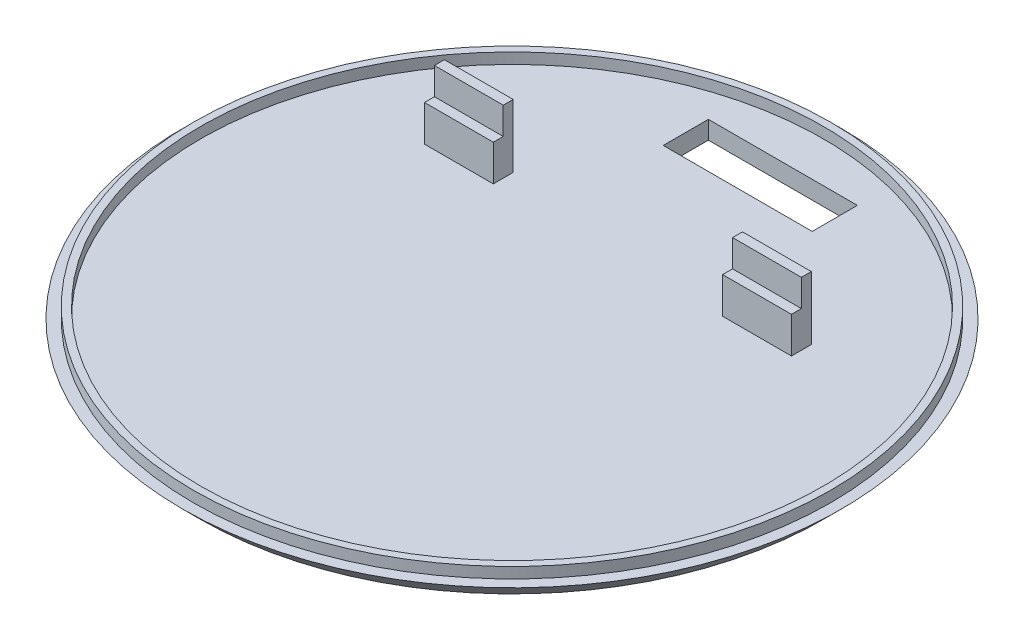
ISO-10303-21;
HEADER;
FILE_DESCRIPTION(('STEP AP214'),'2;1');
FILE_NAME('part.step','',(''),(''),'','','');
FILE_SCHEMA(('AUTOMOTIVE_DESIGN { 1 0 10303 214 1 1 1 1 }'));
ENDSEC;
DATA;
#1=APPLICATION_CONTEXT('core data for automotive mechanical design processes');
#2=APPLICATION_PROTOCOL_DEFINITION('international standard','automotive_design',2000,#1);
#3=PRODUCT_CONTEXT('',#1,'mechanical');
#4=PRODUCT('Part','Part','',(#3));
#5=PRODUCT_RELATED_PRODUCT_CATEGORY('part','',(#4));
#6=PRODUCT_DEFINITION_FORMATION('','',#4);
#7=PRODUCT_DEFINITION_CONTEXT('part definition',#1,'design');
#8=PRODUCT_DEFINITION('design','',#6,#7);
#9=PRODUCT_DEFINITION_SHAPE('','',#8);
#10=(LENGTH_UNIT() NAMED_UNIT(*) SI_UNIT(.MILLI.,.METRE.));
#11=(NAMED_UNIT(*) PLANE_ANGLE_UNIT() SI_UNIT($,.RADIAN.));
#12=(NAMED_UNIT(*) SI_UNIT($,.STERADIAN.) SOLID_ANGLE_UNIT());
#13=UNCERTAINTY_MEASURE_WITH_UNIT(LENGTH_MEASURE(1.E-05),#10,'distance_accuracy_value','');
#14=(GEOMETRIC_REPRESENTATION_CONTEXT(3) GLOBAL_UNCERTAINTY_ASSIGNED_CONTEXT((#13)) GLOBAL_UNIT_ASSIGNED_CONTEXT((#10,
#11,#12)) REPRESENTATION_CONTEXT('',''));
#15=CARTESIAN_POINT('',(0.,0.,0.));
#16=DIRECTION('',(0.,0.,1.));
#17=DIRECTION('',(1.,0.,0.));
#18=AXIS2_PLACEMENT_3D('',#15,#16,#17);
#19=CARTESIAN_POINT('',(0.,0.,0.));
#20=DIRECTION('',(0.,1.,0.));
#21=DIRECTION('',(0.,0.,1.));
#22=AXIS2_PLACEMENT_3D('',#19,#20,#21);
#23=PLANE('',#22);
#24=DIRECTION('',(0.,0.,1.));
#25=VECTOR('',#24,1.);
#26=CARTESIAN_POINT('',(-8.25,0.,-25.));
#27=LINE('',#26,#25);
#28=CARTESIAN_POINT('',(-8.25,0.,-30.));
#29=VERTEX_POINT('',#28);
#30=CARTESIAN_POINT('',(-8.25,0.,-25.));
#31=VERTEX_POINT('',#30);
#32=EDGE_CURVE('E300',#29,#31,#27,.T.);
#33=ORIENTED_EDGE('',*,*,#32,.F.);
#34=DIRECTION('',(-1.,0.,0.));
#35=VECTOR('',#34,1.);
#36=CARTESIAN_POINT('',(-8.25,0.,-30.));
#37=LINE('',#36,#35);
#38=CARTESIAN_POINT('',(8.25,0.,-30.));
#39=VERTEX_POINT('',#38);
#40=EDGE_CURVE('E311',#39,#29,#37,.T.);
#41=ORIENTED_EDGE('',*,*,#40,.F.);
#42=DIRECTION('',(0.,0.,-1.));
#43=VECTOR('',#42,1.);
#44=CARTESIAN_POINT('',(8.25,0.,-25.));
#45=LINE('',#44,#43);
#46=CARTESIAN_POINT('',(8.25,0.,-25.));
#47=VERTEX_POINT('',#46);
#48=EDGE_CURVE('E307',#47,#39,#45,.T.);
#49=ORIENTED_EDGE('',*,*,#48,.F.);
#50=DIRECTION('',(1.,0.,0.));
#51=VECTOR('',#50,1.);
#52=CARTESIAN_POINT('',(-8.25,0.,-25.));
#53=LINE('',#52,#51);
#54=EDGE_CURVE('E303',#31,#47,#53,.T.);
#55=ORIENTED_EDGE('',*,*,#54,.F.);
#56=EDGE_LOOP('',(#33,#41,#49,#55));
#57=FACE_BOUND('',#56,.T.);
#58=CARTESIAN_POINT('',(0.,0.,0.));
#59=DIRECTION('',(0.,1.,0.));
#60=DIRECTION('',(0.,0.,1.));
#61=AXIS2_PLACEMENT_3D('',#58,#59,#60);
#62=CIRCLE('',#61,34.5);
#63=CARTESIAN_POINT('',(0.,0.,34.5));
#64=VERTEX_POINT('',#63);
#65=EDGE_CURVE('E11',#64,#64,#62,.F.);
#66=ORIENTED_EDGE('',*,*,#65,.F.);
#67=EDGE_LOOP('',(#66));
#68=FACE_BOUND('',#67,.T.);
#69=DIRECTION('',(1.,0.,0.));
#70=VECTOR('',#69,1.);
#71=CARTESIAN_POINT('',(-21.59,0.,-11.9));
#72=LINE('',#71,#70);
#73=CARTESIAN_POINT('',(-21.59,0.,-11.9));
#74=VERTEX_POINT('',#73);
#75=CARTESIAN_POINT('',(-13.97,0.,-11.9));
#76=VERTEX_POINT('',#75);
#77=EDGE_CURVE('E266',#74,#76,#72,.T.);
#78=ORIENTED_EDGE('',*,*,#77,.F.);
#79=DIRECTION('',(0.,0.,1.));
#80=VECTOR('',#79,1.);
#81=CARTESIAN_POINT('',(-21.59,0.,-14.1));
#82=LINE('',#81,#80);
#83=CARTESIAN_POINT('',(-21.59,0.,-14.1));
#84=VERTEX_POINT('',#83);
#85=EDGE_CURVE('E251',#84,#74,#82,.T.);
#86=ORIENTED_EDGE('',*,*,#85,.F.);
#87=DIRECTION('',(-1.,0.,0.));
#88=VECTOR('',#87,1.);
#89=CARTESIAN_POINT('',(-21.59,0.,-14.1));
#90=LINE('',#89,#88);
#91=CARTESIAN_POINT('',(-13.97,0.,-14.1));
#92=VERTEX_POINT('',#91);
#93=EDGE_CURVE('E256',#92,#84,#90,.T.);
#94=ORIENTED_EDGE('',*,*,#93,.F.);
#95=DIRECTION('',(0.,0.,-1.));
#96=VECTOR('',#95,1.);
#97=CARTESIAN_POINT('',(-13.97,0.,-14.1));
#98=LINE('',#97,#96);
#99=EDGE_CURVE('E269',#76,#92,#98,.T.);
#100=ORIENTED_EDGE('',*,*,#99,.F.);
#101=EDGE_LOOP('',(#78,#86,#94,#100));
#102=FACE_BOUND('',#101,.T.);
#103=DIRECTION('',(1.,0.,0.));
#104=VECTOR('',#103,1.);
#105=CARTESIAN_POINT('',(11.43,0.,-11.9));
#106=LINE('',#105,#104);
#107=CARTESIAN_POINT('',(11.43,0.,-11.9));
#108=VERTEX_POINT('',#107);
#109=CARTESIAN_POINT('',(19.05,0.,-11.9));
#110=VERTEX_POINT('',#109);
#111=EDGE_CURVE('E230',#108,#110,#106,.T.);
#112=ORIENTED_EDGE('',*,*,#111,.F.);
#113=DIRECTION('',(0.,0.,1.));
#114=VECTOR('',#113,1.);
#115=CARTESIAN_POINT('',(11.43,0.,-14.1));
#116=LINE('',#115,#114);
#117=CARTESIAN_POINT('',(11.43,0.,-14.1));
#118=VERTEX_POINT('',#117);
#119=EDGE_CURVE('E217',#118,#108,#116,.T.);
#120=ORIENTED_EDGE('',*,*,#119,.F.);
#121=DIRECTION('',(-1.,0.,0.));
#122=VECTOR('',#121,1.);
#123=CARTESIAN_POINT('',(11.43,0.,-14.1));
#124=LINE('',#123,#122);
#125=CARTESIAN_POINT('',(19.05,0.,-14.1));
#126=VERTEX_POINT('',#125);
#127=EDGE_CURVE('E221',#126,#118,#124,.T.);
#128=ORIENTED_EDGE('',*,*,#127,.F.);
#129=DIRECTION('',(0.,0.,-1.));
#130=VECTOR('',#129,1.);
#131=CARTESIAN_POINT('',(19.05,0.,-14.1));
#132=LINE('',#131,#130);
#133=EDGE_CURVE('E233',#110,#126,#132,.T.);
#134=ORIENTED_EDGE('',*,*,#133,.F.);
#135=EDGE_LOOP('',(#112,#120,#128,#134));
#136=FACE_BOUND('',#135,.T.);
#137=ADVANCED_FACE('F43',(#57,#68,#102,#136),#23,.T.);
#138=CARTESIAN_POINT('',(0.,-2.,0.));
#139=DIRECTION('',(0.,-1.,0.));
#140=DIRECTION('',(0.,0.,-1.));
#141=AXIS2_PLACEMENT_3D('',#138,#139,#140);
#142=PLANE('',#141);
#143=DIRECTION('',(0.,0.,1.));
#144=VECTOR('',#143,1.);
#145=CARTESIAN_POINT('',(-8.25,-2.,-25.));
#146=LINE('',#145,#144);
#147=CARTESIAN_POINT('',(-8.25,-2.,-30.));
#148=VERTEX_POINT('',#147);
#149=CARTESIAN_POINT('',(-8.25,-2.,-25.));
#150=VERTEX_POINT('',#149);
#151=EDGE_CURVE('E296',#148,#150,#146,.T.);
#152=ORIENTED_EDGE('',*,*,#151,.T.);
#153=DIRECTION('',(1.,0.,0.));
#154=VECTOR('',#153,1.);
#155=CARTESIAN_POINT('',(-8.25,-2.,-25.));
#156=LINE('',#155,#154);
#157=CARTESIAN_POINT('',(8.25,-2.,-25.));
#158=VERTEX_POINT('',#157);
#159=EDGE_CURVE('E319',#150,#158,#156,.T.);
#160=ORIENTED_EDGE('',*,*,#159,.T.);
#161=DIRECTION('',(0.,0.,-1.));
#162=VECTOR('',#161,1.);
#163=CARTESIAN_POINT('',(8.25,-2.,-25.));
#164=LINE('',#163,#162);
#165=CARTESIAN_POINT('',(8.25,-2.,-30.));
#166=VERTEX_POINT('',#165);
#167=EDGE_CURVE('E288',#158,#166,#164,.T.);
#168=ORIENTED_EDGE('',*,*,#167,.T.);
#169=DIRECTION('',(-1.,0.,0.));
#170=VECTOR('',#169,1.);
#171=CARTESIAN_POINT('',(-8.25,-2.,-30.));
#172=LINE('',#171,#170);
#173=EDGE_CURVE('E292',#166,#148,#172,.T.);
#174=ORIENTED_EDGE('',*,*,#173,.T.);
#175=EDGE_LOOP('',(#152,#160,#168,#174));
#176=FACE_BOUND('',#175,.T.);
#177=CARTESIAN_POINT('',(0.,-1.99999999999999,0.));
#178=DIRECTION('',(0.,1.,0.));
#179=DIRECTION('',(0.,0.,1.));
#180=AXIS2_PLACEMENT_3D('',#177,#178,#179);
#181=CIRCLE('',#180,34.5);
#182=CARTESIAN_POINT('',(0.,-1.99999999999999,34.5));
#183=VERTEX_POINT('',#182);
#184=EDGE_CURVE('E337',#183,#183,#181,.T.);
#185=ORIENTED_EDGE('',*,*,#184,.F.);
#186=EDGE_LOOP('',(#185));
#187=FACE_BOUND('',#186,.T.);
#188=ADVANCED_FACE('F369',(#176,#187),#142,.T.);
#189=CARTESIAN_POINT('',(0.,0.,0.));
#190=DIRECTION('',(0.,1.,0.));
#191=DIRECTION('',(0.,0.,1.));
#192=AXIS2_PLACEMENT_3D('',#189,#190,#191);
#193=CONICAL_SURFACE('',#192,36.5,0.78539816339744);
#194=ORIENTED_EDGE('',*,*,#184,.T.);
#195=EDGE_LOOP('',(#194));
#196=FACE_BOUND('',#195,.T.);
#197=CARTESIAN_POINT('',(0.,0.,0.));
#198=DIRECTION('',(0.,1.,0.));
#199=DIRECTION('',(0.,0.,1.));
#200=AXIS2_PLACEMENT_3D('',#197,#198,#199);
#201=CIRCLE('',#200,36.5);
#202=CARTESIAN_POINT('',(0.,0.,36.5));
#203=VERTEX_POINT('',#202);
#204=EDGE_CURVE('E333',#203,#203,#201,.T.);
#205=ORIENTED_EDGE('',*,*,#204,.F.);
#206=EDGE_LOOP('',(#205));
#207=FACE_BOUND('',#206,.T.);
#208=ADVANCED_FACE('F364',(#196,#207),#193,.T.);
#209=CARTESIAN_POINT('',(0.,0.,0.));
#210=DIRECTION('',(0.,1.,0.));
#211=DIRECTION('',(0.,0.,1.));
#212=AXIS2_PLACEMENT_3D('',#209,#210,#211);
#213=CIRCLE('',#212,35.3);
#214=CARTESIAN_POINT('',(0.,0.,35.3));
#215=VERTEX_POINT('',#214);
#216=EDGE_CURVE('E53',#215,#215,#213,.F.);
#217=ORIENTED_EDGE('',*,*,#216,.T.);
#218=EDGE_LOOP('',(#217));
#219=FACE_BOUND('',#218,.T.);
#220=ORIENTED_EDGE('',*,*,#204,.T.);
#221=EDGE_LOOP('',(#220));
#222=FACE_BOUND('',#221,.T.);
#223=ADVANCED_FACE('F356',(#219,#222),#23,.T.);
#224=CARTESIAN_POINT('',(35.3,1.2,0.));
#225=DIRECTION('',(0.,-1.,0.));
#226=DIRECTION('',(0.,0.,-1.));
#227=AXIS2_PLACEMENT_3D('',#224,#225,#226);
#228=PLANE('',#227);
#229=CARTESIAN_POINT('',(0.,1.2,0.));
#230=DIRECTION('',(0.,1.,0.));
#231=DIRECTION('',(0.,0.,1.));
#232=AXIS2_PLACEMENT_3D('',#229,#230,#231);
#233=CIRCLE('',#232,34.5);
#234=CARTESIAN_POINT('',(0.,1.2,34.5));
#235=VERTEX_POINT('',#234);
#236=EDGE_CURVE('E47',#235,#235,#233,.T.);
#237=ORIENTED_EDGE('',*,*,#236,.F.);
#238=EDGE_LOOP('',(#237));
#239=FACE_BOUND('',#238,.T.);
#240=CARTESIAN_POINT('',(0.,1.2,0.));
#241=DIRECTION('',(0.,1.,0.));
#242=DIRECTION('',(0.,0.,1.));
#243=AXIS2_PLACEMENT_3D('',#240,#241,#242);
#244=CIRCLE('',#243,35.3);
#245=CARTESIAN_POINT('',(0.,1.2,35.3));
#246=VERTEX_POINT('',#245);
#247=EDGE_CURVE('E332',#246,#246,#244,.T.);
#248=ORIENTED_EDGE('',*,*,#247,.T.);
#249=EDGE_LOOP('',(#248));
#250=FACE_BOUND('',#249,.T.);
#251=ADVANCED_FACE('F353',(#239,#250),#228,.F.);
#252=CARTESIAN_POINT('',(0.,31.706596316955,0.));
#253=DIRECTION('',(0.,1.,0.));
#254=DIRECTION('',(0.,0.,1.));
#255=AXIS2_PLACEMENT_3D('',#252,#253,#254);
#256=CYLINDRICAL_SURFACE('',#255,35.3);
#257=ORIENTED_EDGE('',*,*,#247,.F.);
#258=EDGE_LOOP('',(#257));
#259=FACE_BOUND('',#258,.T.);
#260=ORIENTED_EDGE('',*,*,#216,.F.);
#261=EDGE_LOOP('',(#260));
#262=FACE_BOUND('',#261,.T.);
#263=ADVANCED_FACE('F355',(#259,#262),#256,.T.);
#264=CARTESIAN_POINT('',(0.,31.706596316955,0.));
#265=DIRECTION('',(0.,1.,0.));
#266=DIRECTION('',(0.,0.,1.));
#267=AXIS2_PLACEMENT_3D('',#264,#265,#266);
#268=CYLINDRICAL_SURFACE('',#267,34.5);
#269=ORIENTED_EDGE('',*,*,#236,.T.);
#270=EDGE_LOOP('',(#269));
#271=FACE_BOUND('',#270,.T.);
#272=ORIENTED_EDGE('',*,*,#65,.T.);
#273=EDGE_LOOP('',(#272));
#274=FACE_BOUND('',#273,.T.);
#275=ADVANCED_FACE('F45',(#271,#274),#268,.F.);
#276=CARTESIAN_POINT('',(-8.25,-2.001,-25.));
#277=DIRECTION('',(-1.,0.,0.));
#278=DIRECTION('',(0.,0.,1.));
#279=AXIS2_PLACEMENT_3D('',#276,#277,#278);
#280=PLANE('',#279);
#281=DIRECTION('',(0.,1.,0.));
#282=VECTOR('',#281,1.);
#283=CARTESIAN_POINT('',(-8.25,-2.001,-30.));
#284=LINE('',#283,#282);
#285=EDGE_CURVE('E316',#148,#29,#284,.T.);
#286=ORIENTED_EDGE('',*,*,#285,.T.);
#287=ORIENTED_EDGE('',*,*,#32,.T.);
#288=DIRECTION('',(0.,1.,0.));
#289=VECTOR('',#288,1.);
#290=CARTESIAN_POINT('',(-8.25,-2.001,-25.));
#291=LINE('',#290,#289);
#292=EDGE_CURVE('E315',#150,#31,#291,.T.);
#293=ORIENTED_EDGE('',*,*,#292,.F.);
#294=ORIENTED_EDGE('',*,*,#151,.F.);
#295=EDGE_LOOP('',(#286,#287,#293,#294));
#296=FACE_BOUND('',#295,.T.);
#297=ADVANCED_FACE('F363',(#296),#280,.F.);
#298=CARTESIAN_POINT('',(-8.25,-2.001,-30.));
#299=DIRECTION('',(0.,0.,-1.));
#300=DIRECTION('',(-1.,0.,0.));
#301=AXIS2_PLACEMENT_3D('',#298,#299,#300);
#302=PLANE('',#301);
#303=DIRECTION('',(0.,1.,0.));
#304=VECTOR('',#303,1.);
#305=CARTESIAN_POINT('',(8.25,-2.001,-30.));
#306=LINE('',#305,#304);
#307=EDGE_CURVE('E320',#166,#39,#306,.T.);
#308=ORIENTED_EDGE('',*,*,#307,.T.);
#309=ORIENTED_EDGE('',*,*,#40,.T.);
#310=ORIENTED_EDGE('',*,*,#285,.F.);
#311=ORIENTED_EDGE('',*,*,#173,.F.);
#312=EDGE_LOOP('',(#308,#309,#310,#311));
#313=FACE_BOUND('',#312,.T.);
#314=ADVANCED_FACE('F426',(#313),#302,.F.);
#315=CARTESIAN_POINT('',(8.25,-2.001,-25.));
#316=DIRECTION('',(1.,0.,0.));
#317=DIRECTION('',(0.,0.,-1.));
#318=AXIS2_PLACEMENT_3D('',#315,#316,#317);
#319=PLANE('',#318);
#320=DIRECTION('',(0.,1.,0.));
#321=VECTOR('',#320,1.);
#322=CARTESIAN_POINT('',(8.25,-2.001,-25.));
#323=LINE('',#322,#321);
#324=EDGE_CURVE('E323',#158,#47,#323,.T.);
#325=ORIENTED_EDGE('',*,*,#324,.T.);
#326=ORIENTED_EDGE('',*,*,#48,.T.);
#327=ORIENTED_EDGE('',*,*,#307,.F.);
#328=ORIENTED_EDGE('',*,*,#167,.F.);
#329=EDGE_LOOP('',(#325,#326,#327,#328));
#330=FACE_BOUND('',#329,.T.);
#331=ADVANCED_FACE('F435',(#330),#319,.F.);
#332=CARTESIAN_POINT('',(-8.25,-2.001,-25.));
#333=DIRECTION('',(0.,0.,1.));
#334=DIRECTION('',(1.,0.,0.));
#335=AXIS2_PLACEMENT_3D('',#332,#333,#334);
#336=PLANE('',#335);
#337=ORIENTED_EDGE('',*,*,#292,.T.);
#338=ORIENTED_EDGE('',*,*,#54,.T.);
#339=ORIENTED_EDGE('',*,*,#324,.F.);
#340=ORIENTED_EDGE('',*,*,#159,.F.);
#341=EDGE_LOOP('',(#337,#338,#339,#340));
#342=FACE_BOUND('',#341,.T.);
#343=ADVANCED_FACE('F445',(#342),#336,.F.);
#344=CARTESIAN_POINT('',(-21.59,4.,-14.1));
#345=DIRECTION('',(1.,0.,0.));
#346=DIRECTION('',(0.,0.,-1.));
#347=AXIS2_PLACEMENT_3D('',#344,#345,#346);
#348=PLANE('',#347);
#349=ORIENTED_EDGE('',*,*,#85,.T.);
#350=DIRECTION('',(0.,-1.,0.));
#351=VECTOR('',#350,1.);
#352=CARTESIAN_POINT('',(-21.59,4.,-11.9));
#353=LINE('',#352,#351);
#354=CARTESIAN_POINT('',(-21.59,4.,-11.9));
#355=VERTEX_POINT('',#354);
#356=EDGE_CURVE('E285',#355,#74,#353,.T.);
#357=ORIENTED_EDGE('',*,*,#356,.F.);
#358=DIRECTION('',(0.,0.,1.));
#359=VECTOR('',#358,1.);
#360=CARTESIAN_POINT('',(-21.59,4.,-14.1));
#361=LINE('',#360,#359);
#362=CARTESIAN_POINT('',(-21.59,4.,-13.));
#363=VERTEX_POINT('',#362);
#364=EDGE_CURVE('E252',#363,#355,#361,.T.);
#365=ORIENTED_EDGE('',*,*,#364,.F.);
#366=DIRECTION('',(0.,-1.,0.));
#367=VECTOR('',#366,1.);
#368=CARTESIAN_POINT('',(-21.59,7.,-13.));
#369=LINE('',#368,#367);
#370=CARTESIAN_POINT('',(-21.59,7.,-13.));
#371=VERTEX_POINT('',#370);
#372=EDGE_CURVE('E213',#371,#363,#369,.T.);
#373=ORIENTED_EDGE('',*,*,#372,.F.);
#374=DIRECTION('',(0.,0.,1.));
#375=VECTOR('',#374,1.);
#376=CARTESIAN_POINT('',(-21.59,7.,-14.1));
#377=LINE('',#376,#375);
#378=CARTESIAN_POINT('',(-21.59,7.,-14.1));
#379=VERTEX_POINT('',#378);
#380=EDGE_CURVE('E190',#379,#371,#377,.T.);
#381=ORIENTED_EDGE('',*,*,#380,.F.);
#382=DIRECTION('',(0.,-1.,0.));
#383=VECTOR('',#382,1.);
#384=CARTESIAN_POINT('',(-21.59,4.,-14.1));
#385=LINE('',#384,#383);
#386=EDGE_CURVE('E262',#379,#84,#385,.T.);
#387=ORIENTED_EDGE('',*,*,#386,.T.);
#388=EDGE_LOOP('',(#349,#357,#365,#373,#381,#387));
#389=FACE_BOUND('',#388,.T.);
#390=ADVANCED_FACE('F454',(#389),#348,.F.);
#391=CARTESIAN_POINT('',(-21.59,4.,-11.9));
#392=DIRECTION('',(0.,0.,-1.));
#393=DIRECTION('',(-1.,0.,0.));
#394=AXIS2_PLACEMENT_3D('',#391,#392,#393);
#395=PLANE('',#394);
#396=ORIENTED_EDGE('',*,*,#77,.T.);
#397=DIRECTION('',(0.,-1.,0.));
#398=VECTOR('',#397,1.);
#399=CARTESIAN_POINT('',(-13.97,4.,-11.9));
#400=LINE('',#399,#398);
#401=CARTESIAN_POINT('',(-13.97,4.,-11.9));
#402=VERTEX_POINT('',#401);
#403=EDGE_CURVE('E281',#402,#76,#400,.T.);
#404=ORIENTED_EDGE('',*,*,#403,.F.);
#405=DIRECTION('',(1.,0.,0.));
#406=VECTOR('',#405,1.);
#407=CARTESIAN_POINT('',(-21.59,4.,-11.9));
#408=LINE('',#407,#406);
#409=EDGE_CURVE('E255',#355,#402,#408,.T.);
#410=ORIENTED_EDGE('',*,*,#409,.F.);
#411=ORIENTED_EDGE('',*,*,#356,.T.);
#412=EDGE_LOOP('',(#396,#404,#410,#411));
#413=FACE_BOUND('',#412,.T.);
#414=ADVANCED_FACE('F467',(#413),#395,.F.);
#415=CARTESIAN_POINT('',(-13.97,4.,-14.1));
#416=DIRECTION('',(-1.,0.,0.));
#417=DIRECTION('',(0.,0.,1.));
#418=AXIS2_PLACEMENT_3D('',#415,#416,#417);
#419=PLANE('',#418);
#420=ORIENTED_EDGE('',*,*,#99,.T.);
#421=DIRECTION('',(0.,-1.,0.));
#422=VECTOR('',#421,1.);
#423=CARTESIAN_POINT('',(-13.97,4.,-14.1));
#424=LINE('',#423,#422);
#425=CARTESIAN_POINT('',(-13.97,7.,-14.1));
#426=VERTEX_POINT('',#425);
#427=EDGE_CURVE('E278',#426,#92,#424,.T.);
#428=ORIENTED_EDGE('',*,*,#427,.F.);
#429=DIRECTION('',(0.,0.,-1.));
#430=VECTOR('',#429,1.);
#431=CARTESIAN_POINT('',(-13.97,7.,-14.1));
#432=LINE('',#431,#430);
#433=CARTESIAN_POINT('',(-13.97,7.,-13.));
#434=VERTEX_POINT('',#433);
#435=EDGE_CURVE('E201',#434,#426,#432,.T.);
#436=ORIENTED_EDGE('',*,*,#435,.F.);
#437=DIRECTION('',(0.,-1.,0.));
#438=VECTOR('',#437,1.);
#439=CARTESIAN_POINT('',(-13.97,7.,-13.));
#440=LINE('',#439,#438);
#441=CARTESIAN_POINT('',(-13.97,4.,-13.));
#442=VERTEX_POINT('',#441);
#443=EDGE_CURVE('E208',#434,#442,#440,.T.);
#444=ORIENTED_EDGE('',*,*,#443,.T.);
#445=DIRECTION('',(0.,0.,-1.));
#446=VECTOR('',#445,1.);
#447=CARTESIAN_POINT('',(-13.97,4.,-14.1));
#448=LINE('',#447,#446);
#449=EDGE_CURVE('E259',#402,#442,#448,.T.);
#450=ORIENTED_EDGE('',*,*,#449,.F.);
#451=ORIENTED_EDGE('',*,*,#403,.T.);
#452=EDGE_LOOP('',(#420,#428,#436,#444,#450,#451));
#453=FACE_BOUND('',#452,.T.);
#454=ADVANCED_FACE('F472',(#453),#419,.F.);
#455=CARTESIAN_POINT('',(-21.59,4.,-14.1));
#456=DIRECTION('',(0.,0.,1.));
#457=DIRECTION('',(1.,0.,0.));
#458=AXIS2_PLACEMENT_3D('',#455,#456,#457);
#459=PLANE('',#458);
#460=ORIENTED_EDGE('',*,*,#93,.T.);
#461=ORIENTED_EDGE('',*,*,#386,.F.);
#462=DIRECTION('',(-1.,0.,0.));
#463=VECTOR('',#462,1.);
#464=CARTESIAN_POINT('',(-21.59,7.,-14.1));
#465=LINE('',#464,#463);
#466=EDGE_CURVE('E205',#426,#379,#465,.T.);
#467=ORIENTED_EDGE('',*,*,#466,.F.);
#468=ORIENTED_EDGE('',*,*,#427,.T.);
#469=EDGE_LOOP('',(#460,#461,#467,#468));
#470=FACE_BOUND('',#469,.T.);
#471=ADVANCED_FACE('F507',(#470),#459,.F.);
#472=CARTESIAN_POINT('',(0.,4.,0.));
#473=DIRECTION('',(0.,1.,0.));
#474=DIRECTION('',(0.,0.,1.));
#475=AXIS2_PLACEMENT_3D('',#472,#473,#474);
#476=PLANE('',#475);
#477=DIRECTION('',(1.,0.,0.));
#478=VECTOR('',#477,1.);
#479=CARTESIAN_POINT('',(-21.59,4.,-13.));
#480=LINE('',#479,#478);
#481=EDGE_CURVE('E69',#363,#442,#480,.T.);
#482=ORIENTED_EDGE('',*,*,#481,.F.);
#483=ORIENTED_EDGE('',*,*,#364,.T.);
#484=ORIENTED_EDGE('',*,*,#409,.T.);
#485=ORIENTED_EDGE('',*,*,#449,.T.);
#486=EDGE_LOOP('',(#482,#483,#484,#485));
#487=FACE_BOUND('',#486,.T.);
#488=ADVANCED_FACE('F517',(#487),#476,.T.);
#489=CARTESIAN_POINT('',(11.43,4.,-14.1));
#490=DIRECTION('',(1.,0.,0.));
#491=DIRECTION('',(0.,0.,-1.));
#492=AXIS2_PLACEMENT_3D('',#489,#490,#491);
#493=PLANE('',#492);
#494=ORIENTED_EDGE('',*,*,#119,.T.);
#495=DIRECTION('',(0.,-1.,0.));
#496=VECTOR('',#495,1.);
#497=CARTESIAN_POINT('',(11.43,4.,-11.9));
#498=LINE('',#497,#496);
#499=CARTESIAN_POINT('',(11.43,4.,-11.9));
#500=VERTEX_POINT('',#499);
#501=EDGE_CURVE('E248',#500,#108,#498,.T.);
#502=ORIENTED_EDGE('',*,*,#501,.F.);
#503=DIRECTION('',(0.,0.,1.));
#504=VECTOR('',#503,1.);
#505=CARTESIAN_POINT('',(11.43,4.,-14.1));
#506=LINE('',#505,#504);
#507=CARTESIAN_POINT('',(11.43,4.,-13.));
#508=VERTEX_POINT('',#507);
#509=EDGE_CURVE('E185',#508,#500,#506,.T.);
#510=ORIENTED_EDGE('',*,*,#509,.F.);
#511=DIRECTION('',(0.,-1.,0.));
#512=VECTOR('',#511,1.);
#513=CARTESIAN_POINT('',(11.43,7.,-13.));
#514=LINE('',#513,#512);
#515=CARTESIAN_POINT('',(11.43,7.,-13.));
#516=VERTEX_POINT('',#515);
#517=EDGE_CURVE('E163',#516,#508,#514,.T.);
#518=ORIENTED_EDGE('',*,*,#517,.F.);
#519=DIRECTION('',(0.,0.,1.));
#520=VECTOR('',#519,1.);
#521=CARTESIAN_POINT('',(11.43,7.,-14.1));
#522=LINE('',#521,#520);
#523=CARTESIAN_POINT('',(11.43,7.,-14.1));
#524=VERTEX_POINT('',#523);
#525=EDGE_CURVE('E171',#524,#516,#522,.T.);
#526=ORIENTED_EDGE('',*,*,#525,.F.);
#527=DIRECTION('',(0.,-1.,0.));
#528=VECTOR('',#527,1.);
#529=CARTESIAN_POINT('',(11.43,4.,-14.1));
#530=LINE('',#529,#528);
#531=EDGE_CURVE('E227',#524,#118,#530,.T.);
#532=ORIENTED_EDGE('',*,*,#531,.T.);
#533=EDGE_LOOP('',(#494,#502,#510,#518,#526,#532));
#534=FACE_BOUND('',#533,.T.);
#535=ADVANCED_FACE('F183',(#534),#493,.F.);
#536=CARTESIAN_POINT('',(11.43,4.,-11.9));
#537=DIRECTION('',(0.,0.,-1.));
#538=DIRECTION('',(-1.,0.,0.));
#539=AXIS2_PLACEMENT_3D('',#536,#537,#538);
#540=PLANE('',#539);
#541=ORIENTED_EDGE('',*,*,#111,.T.);
#542=DIRECTION('',(0.,-1.,0.));
#543=VECTOR('',#542,1.);
#544=CARTESIAN_POINT('',(19.05,4.,-11.9));
#545=LINE('',#544,#543);
#546=CARTESIAN_POINT('',(19.05,4.,-11.9));
#547=VERTEX_POINT('',#546);
#548=EDGE_CURVE('E244',#547,#110,#545,.T.);
#549=ORIENTED_EDGE('',*,*,#548,.F.);
#550=DIRECTION('',(1.,0.,0.));
#551=VECTOR('',#550,1.);
#552=CARTESIAN_POINT('',(11.43,4.,-11.9));
#553=LINE('',#552,#551);
#554=EDGE_CURVE('E220',#500,#547,#553,.T.);
#555=ORIENTED_EDGE('',*,*,#554,.F.);
#556=ORIENTED_EDGE('',*,*,#501,.T.);
#557=EDGE_LOOP('',(#541,#549,#555,#556));
#558=FACE_BOUND('',#557,.T.);
#559=ADVANCED_FACE('F480',(#558),#540,.F.);
#560=CARTESIAN_POINT('',(19.05,4.,-14.1));
#561=DIRECTION('',(-1.,0.,0.));
#562=DIRECTION('',(0.,0.,1.));
#563=AXIS2_PLACEMENT_3D('',#560,#561,#562);
#564=PLANE('',#563);
#565=ORIENTED_EDGE('',*,*,#133,.T.);
#566=DIRECTION('',(0.,-1.,0.));
#567=VECTOR('',#566,1.);
#568=CARTESIAN_POINT('',(19.05,4.,-14.1));
#569=LINE('',#568,#567);
#570=CARTESIAN_POINT('',(19.05,7.,-14.1));
#571=VERTEX_POINT('',#570);
#572=EDGE_CURVE('E241',#571,#126,#569,.T.);
#573=ORIENTED_EDGE('',*,*,#572,.F.);
#574=DIRECTION('',(0.,0.,-1.));
#575=VECTOR('',#574,1.);
#576=CARTESIAN_POINT('',(19.05,7.,-14.1));
#577=LINE('',#576,#575);
#578=CARTESIAN_POINT('',(19.05,7.,-13.));
#579=VERTEX_POINT('',#578);
#580=EDGE_CURVE('E170',#579,#571,#577,.T.);
#581=ORIENTED_EDGE('',*,*,#580,.F.);
#582=DIRECTION('',(0.,-1.,0.));
#583=VECTOR('',#582,1.);
#584=CARTESIAN_POINT('',(19.05,7.,-13.));
#585=LINE('',#584,#583);
#586=CARTESIAN_POINT('',(19.05,4.,-13.));
#587=VERTEX_POINT('',#586);
#588=EDGE_CURVE('E165',#579,#587,#585,.T.);
#589=ORIENTED_EDGE('',*,*,#588,.T.);
#590=DIRECTION('',(0.,0.,-1.));
#591=VECTOR('',#590,1.);
#592=CARTESIAN_POINT('',(19.05,4.,-14.1));
#593=LINE('',#592,#591);
#594=EDGE_CURVE('E224',#547,#587,#593,.T.);
#595=ORIENTED_EDGE('',*,*,#594,.F.);
#596=ORIENTED_EDGE('',*,*,#548,.T.);
#597=EDGE_LOOP('',(#565,#573,#581,#589,#595,#596));
#598=FACE_BOUND('',#597,.T.);
#599=ADVANCED_FACE('F485',(#598),#564,.F.);
#600=CARTESIAN_POINT('',(11.43,4.,-14.1));
#601=DIRECTION('',(0.,0.,1.));
#602=DIRECTION('',(1.,0.,0.));
#603=AXIS2_PLACEMENT_3D('',#600,#601,#602);
#604=PLANE('',#603);
#605=ORIENTED_EDGE('',*,*,#127,.T.);
#606=ORIENTED_EDGE('',*,*,#531,.F.);
#607=DIRECTION('',(-1.,0.,0.));
#608=VECTOR('',#607,1.);
#609=CARTESIAN_POINT('',(11.43,7.,-14.1));
#610=LINE('',#609,#608);
#611=EDGE_CURVE('E177',#571,#524,#610,.T.);
#612=ORIENTED_EDGE('',*,*,#611,.F.);
#613=ORIENTED_EDGE('',*,*,#572,.T.);
#614=EDGE_LOOP('',(#605,#606,#612,#613));
#615=FACE_BOUND('',#614,.T.);
#616=ADVANCED_FACE('F542',(#615),#604,.F.);
#617=CARTESIAN_POINT('',(0.,4.,0.));
#618=DIRECTION('',(0.,1.,0.));
#619=DIRECTION('',(0.,0.,1.));
#620=AXIS2_PLACEMENT_3D('',#617,#618,#619);
#621=PLANE('',#620);
#622=DIRECTION('',(1.,0.,0.));
#623=VECTOR('',#622,1.);
#624=CARTESIAN_POINT('',(11.43,4.,-13.));
#625=LINE('',#624,#623);
#626=EDGE_CURVE('E61',#508,#587,#625,.T.);
#627=ORIENTED_EDGE('',*,*,#626,.F.);
#628=ORIENTED_EDGE('',*,*,#509,.T.);
#629=ORIENTED_EDGE('',*,*,#554,.T.);
#630=ORIENTED_EDGE('',*,*,#594,.T.);
#631=EDGE_LOOP('',(#627,#628,#629,#630));
#632=FACE_BOUND('',#631,.T.);
#633=ADVANCED_FACE('F552',(#632),#621,.T.);
#634=CARTESIAN_POINT('',(-21.59,7.,-13.));
#635=DIRECTION('',(0.,0.,-1.));
#636=DIRECTION('',(-1.,0.,0.));
#637=AXIS2_PLACEMENT_3D('',#634,#635,#636);
#638=PLANE('',#637);
#639=ORIENTED_EDGE('',*,*,#481,.T.);
#640=ORIENTED_EDGE('',*,*,#443,.F.);
#641=DIRECTION('',(1.,0.,0.));
#642=VECTOR('',#641,1.);
#643=CARTESIAN_POINT('',(-21.59,7.,-13.));
#644=LINE('',#643,#642);
#645=EDGE_CURVE('E198',#371,#434,#644,.T.);
#646=ORIENTED_EDGE('',*,*,#645,.F.);
#647=ORIENTED_EDGE('',*,*,#372,.T.);
#648=EDGE_LOOP('',(#639,#640,#646,#647));
#649=FACE_BOUND('',#648,.T.);
#650=ADVANCED_FACE('F563',(#649),#638,.F.);
#651=CARTESIAN_POINT('',(0.,7.,0.));
#652=DIRECTION('',(0.,1.,0.));
#653=DIRECTION('',(0.,0.,1.));
#654=AXIS2_PLACEMENT_3D('',#651,#652,#653);
#655=PLANE('',#654);
#656=ORIENTED_EDGE('',*,*,#380,.T.);
#657=ORIENTED_EDGE('',*,*,#645,.T.);
#658=ORIENTED_EDGE('',*,*,#435,.T.);
#659=ORIENTED_EDGE('',*,*,#466,.T.);
#660=EDGE_LOOP('',(#656,#657,#658,#659));
#661=FACE_BOUND('',#660,.T.);
#662=ADVANCED_FACE('F571',(#661),#655,.T.);
#663=CARTESIAN_POINT('',(11.43,7.,-13.));
#664=DIRECTION('',(0.,0.,-1.));
#665=DIRECTION('',(-1.,0.,0.));
#666=AXIS2_PLACEMENT_3D('',#663,#664,#665);
#667=PLANE('',#666);
#668=ORIENTED_EDGE('',*,*,#626,.T.);
#669=ORIENTED_EDGE('',*,*,#588,.F.);
#670=DIRECTION('',(1.,0.,0.));
#671=VECTOR('',#670,1.);
#672=CARTESIAN_POINT('',(11.43,7.,-13.));
#673=LINE('',#672,#671);
#674=EDGE_CURVE('E159',#516,#579,#673,.T.);
#675=ORIENTED_EDGE('',*,*,#674,.F.);
#676=ORIENTED_EDGE('',*,*,#517,.T.);
#677=EDGE_LOOP('',(#668,#669,#675,#676));
#678=FACE_BOUND('',#677,.T.);
#679=ADVANCED_FACE('F161',(#678),#667,.F.);
#680=CARTESIAN_POINT('',(0.,7.,0.));
#681=DIRECTION('',(0.,1.,0.));
#682=DIRECTION('',(0.,0.,1.));
#683=AXIS2_PLACEMENT_3D('',#680,#681,#682);
#684=PLANE('',#683);
#685=ORIENTED_EDGE('',*,*,#525,.T.);
#686=ORIENTED_EDGE('',*,*,#674,.T.);
#687=ORIENTED_EDGE('',*,*,#580,.T.);
#688=ORIENTED_EDGE('',*,*,#611,.T.);
#689=EDGE_LOOP('',(#685,#686,#687,#688));
#690=FACE_BOUND('',#689,.T.);
#691=ADVANCED_FACE('F175',(#690),#684,.T.);
#692=CLOSED_SHELL('',(#137,#188,#208,#223,#251,#263,#275,#297,#314,#331,#343,#390,#414,#454,
#471,#488,#535,#559,#599,#616,#633,#650,#662,#679,#691));
#693=MANIFOLD_SOLID_BREP('B2',#692);
#694=ADVANCED_BREP_SHAPE_REPRESENTATION('',(#18,#693),#14);
#695=SHAPE_DEFINITION_REPRESENTATION(#9,#694);
ENDSEC;
END-ISO-10303-21;
